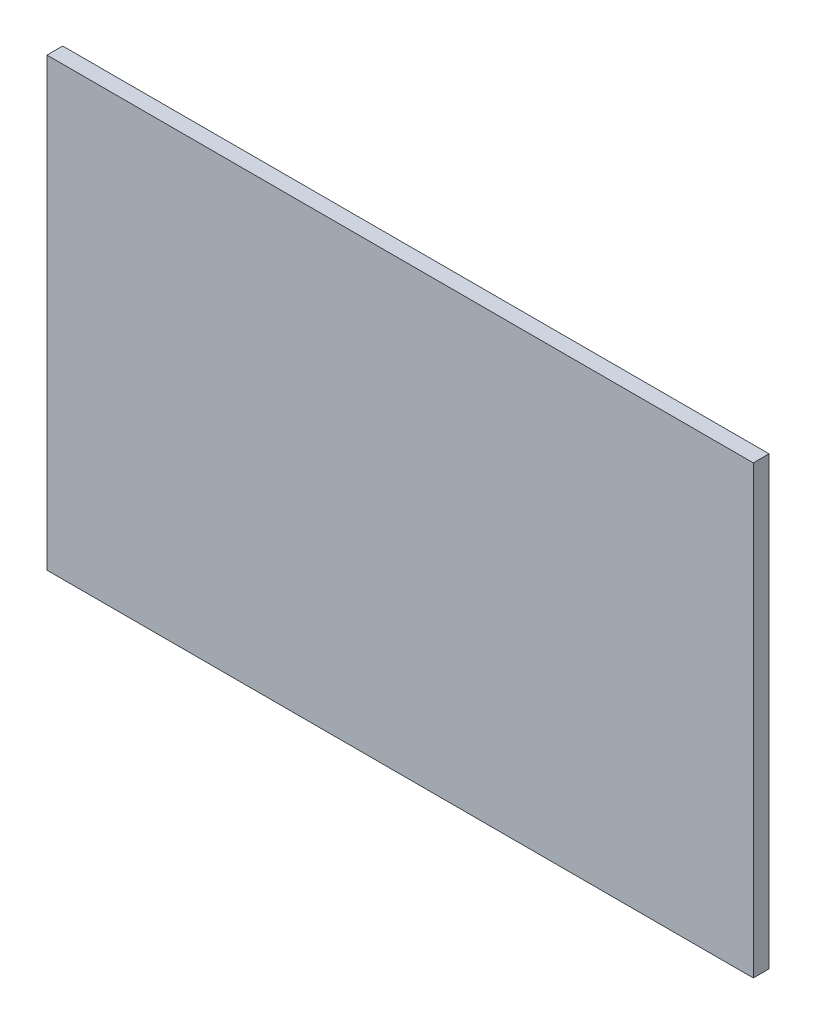
ISO-10303-21;
HEADER;
FILE_DESCRIPTION(('STEP AP214'),'2;1');
FILE_NAME('part.step','',(''),(''),'','','');
FILE_SCHEMA(('AUTOMOTIVE_DESIGN { 1 0 10303 214 1 1 1 1 }'));
ENDSEC;
DATA;
#1=APPLICATION_CONTEXT('core data for automotive mechanical design processes');
#2=APPLICATION_PROTOCOL_DEFINITION('international standard','automotive_design',2000,#1);
#3=PRODUCT_CONTEXT('',#1,'mechanical');
#4=PRODUCT('Part','Part','',(#3));
#5=PRODUCT_RELATED_PRODUCT_CATEGORY('part','',(#4));
#6=PRODUCT_DEFINITION_FORMATION('','',#4);
#7=PRODUCT_DEFINITION_CONTEXT('part definition',#1,'design');
#8=PRODUCT_DEFINITION('design','',#6,#7);
#9=PRODUCT_DEFINITION_SHAPE('','',#8);
#10=(LENGTH_UNIT() NAMED_UNIT(*) SI_UNIT(.MILLI.,.METRE.));
#11=(NAMED_UNIT(*) PLANE_ANGLE_UNIT() SI_UNIT($,.RADIAN.));
#12=(NAMED_UNIT(*) SI_UNIT($,.STERADIAN.) SOLID_ANGLE_UNIT());
#13=UNCERTAINTY_MEASURE_WITH_UNIT(LENGTH_MEASURE(1.E-05),#10,'distance_accuracy_value','');
#14=(GEOMETRIC_REPRESENTATION_CONTEXT(3) GLOBAL_UNCERTAINTY_ASSIGNED_CONTEXT((#13)) GLOBAL_UNIT_ASSIGNED_CONTEXT((#10,
#11,#12)) REPRESENTATION_CONTEXT('',''));
#15=CARTESIAN_POINT('',(0.,0.,0.));
#16=DIRECTION('',(0.,0.,1.));
#17=DIRECTION('',(1.,0.,0.));
#18=AXIS2_PLACEMENT_3D('',#15,#16,#17);
#19=CARTESIAN_POINT('',(0.,0.,17.4625));
#20=DIRECTION('',(1.,0.,0.));
#21=DIRECTION('',(0.,0.,-1.));
#22=AXIS2_PLACEMENT_3D('',#19,#20,#21);
#23=PLANE('',#22);
#24=DIRECTION('',(0.,-1.,0.));
#25=VECTOR('',#24,1.);
#26=CARTESIAN_POINT('',(0.,0.,0.));
#27=LINE('',#26,#25);
#28=CARTESIAN_POINT('',(0.,495.3,0.));
#29=VERTEX_POINT('',#28);
#30=CARTESIAN_POINT('',(0.,0.,0.));
#31=VERTEX_POINT('',#30);
#32=EDGE_CURVE('E95',#29,#31,#27,.T.);
#33=ORIENTED_EDGE('',*,*,#32,.T.);
#34=DIRECTION('',(0.,0.,-1.));
#35=VECTOR('',#34,1.);
#36=CARTESIAN_POINT('',(0.,0.,17.4625));
#37=LINE('',#36,#35);
#38=CARTESIAN_POINT('',(0.,0.,17.4625));
#39=VERTEX_POINT('',#38);
#40=EDGE_CURVE('E11',#39,#31,#37,.T.);
#41=ORIENTED_EDGE('',*,*,#40,.F.);
#42=DIRECTION('',(0.,-1.,0.));
#43=VECTOR('',#42,1.);
#44=CARTESIAN_POINT('',(0.,0.,17.4625));
#45=LINE('',#44,#43);
#46=CARTESIAN_POINT('',(0.,495.3,17.4625));
#47=VERTEX_POINT('',#46);
#48=EDGE_CURVE('E83',#47,#39,#45,.T.);
#49=ORIENTED_EDGE('',*,*,#48,.F.);
#50=DIRECTION('',(0.,0.,-1.));
#51=VECTOR('',#50,1.);
#52=CARTESIAN_POINT('',(0.,495.3,17.4625));
#53=LINE('',#52,#51);
#54=EDGE_CURVE('E91',#47,#29,#53,.T.);
#55=ORIENTED_EDGE('',*,*,#54,.T.);
#56=EDGE_LOOP('',(#33,#41,#49,#55));
#57=FACE_BOUND('',#56,.T.);
#58=ADVANCED_FACE('F32',(#57),#23,.F.);
#59=CARTESIAN_POINT('',(0.,0.,17.4625));
#60=DIRECTION('',(0.,1.,0.));
#61=DIRECTION('',(0.,0.,1.));
#62=AXIS2_PLACEMENT_3D('',#59,#60,#61);
#63=PLANE('',#62);
#64=DIRECTION('',(1.,0.,0.));
#65=VECTOR('',#64,1.);
#66=CARTESIAN_POINT('',(0.,0.,0.));
#67=LINE('',#66,#65);
#68=CARTESIAN_POINT('',(784.225,0.,0.));
#69=VERTEX_POINT('',#68);
#70=EDGE_CURVE('E87',#31,#69,#67,.T.);
#71=ORIENTED_EDGE('',*,*,#70,.T.);
#72=DIRECTION('',(0.,0.,-1.));
#73=VECTOR('',#72,1.);
#74=CARTESIAN_POINT('',(784.225,0.,17.4625));
#75=LINE('',#74,#73);
#76=CARTESIAN_POINT('',(784.225,0.,17.4625));
#77=VERTEX_POINT('',#76);
#78=EDGE_CURVE('E40',#77,#69,#75,.T.);
#79=ORIENTED_EDGE('',*,*,#78,.F.);
#80=DIRECTION('',(1.,0.,0.));
#81=VECTOR('',#80,1.);
#82=CARTESIAN_POINT('',(0.,0.,17.4625));
#83=LINE('',#82,#81);
#84=EDGE_CURVE('E78',#39,#77,#83,.T.);
#85=ORIENTED_EDGE('',*,*,#84,.F.);
#86=ORIENTED_EDGE('',*,*,#40,.T.);
#87=EDGE_LOOP('',(#71,#79,#85,#86));
#88=FACE_BOUND('',#87,.T.);
#89=ADVANCED_FACE('F86',(#88),#63,.F.);
#90=CARTESIAN_POINT('',(784.225,0.,17.4625));
#91=DIRECTION('',(-1.,0.,0.));
#92=DIRECTION('',(0.,0.,1.));
#93=AXIS2_PLACEMENT_3D('',#90,#91,#92);
#94=PLANE('',#93);
#95=DIRECTION('',(0.,1.,0.));
#96=VECTOR('',#95,1.);
#97=CARTESIAN_POINT('',(784.225,0.,0.));
#98=LINE('',#97,#96);
#99=CARTESIAN_POINT('',(784.225,495.3,0.));
#100=VERTEX_POINT('',#99);
#101=EDGE_CURVE('E65',#69,#100,#98,.T.);
#102=ORIENTED_EDGE('',*,*,#101,.T.);
#103=DIRECTION('',(0.,0.,-1.));
#104=VECTOR('',#103,1.);
#105=CARTESIAN_POINT('',(784.225,495.3,17.4625));
#106=LINE('',#105,#104);
#107=CARTESIAN_POINT('',(784.225,495.3,17.4625));
#108=VERTEX_POINT('',#107);
#109=EDGE_CURVE('E88',#108,#100,#106,.T.);
#110=ORIENTED_EDGE('',*,*,#109,.F.);
#111=DIRECTION('',(0.,1.,0.));
#112=VECTOR('',#111,1.);
#113=CARTESIAN_POINT('',(784.225,0.,17.4625));
#114=LINE('',#113,#112);
#115=EDGE_CURVE('E81',#77,#108,#114,.T.);
#116=ORIENTED_EDGE('',*,*,#115,.F.);
#117=ORIENTED_EDGE('',*,*,#78,.T.);
#118=EDGE_LOOP('',(#102,#110,#116,#117));
#119=FACE_BOUND('',#118,.T.);
#120=ADVANCED_FACE('F89',(#119),#94,.F.);
#121=CARTESIAN_POINT('',(0.,495.3,17.4625));
#122=DIRECTION('',(0.,-1.,0.));
#123=DIRECTION('',(0.,0.,-1.));
#124=AXIS2_PLACEMENT_3D('',#121,#122,#123);
#125=PLANE('',#124);
#126=DIRECTION('',(-1.,0.,0.));
#127=VECTOR('',#126,1.);
#128=CARTESIAN_POINT('',(0.,495.3,0.));
#129=LINE('',#128,#127);
#130=EDGE_CURVE('E71',#100,#29,#129,.T.);
#131=ORIENTED_EDGE('',*,*,#130,.T.);
#132=ORIENTED_EDGE('',*,*,#54,.F.);
#133=DIRECTION('',(-1.,0.,0.));
#134=VECTOR('',#133,1.);
#135=CARTESIAN_POINT('',(0.,495.3,17.4625));
#136=LINE('',#135,#134);
#137=EDGE_CURVE('E48',#108,#47,#136,.T.);
#138=ORIENTED_EDGE('',*,*,#137,.F.);
#139=ORIENTED_EDGE('',*,*,#109,.T.);
#140=EDGE_LOOP('',(#131,#132,#138,#139));
#141=FACE_BOUND('',#140,.T.);
#142=ADVANCED_FACE('F102',(#141),#125,.F.);
#143=CARTESIAN_POINT('',(0.,0.,17.4625));
#144=DIRECTION('',(0.,0.,-1.));
#145=DIRECTION('',(-1.,0.,0.));
#146=AXIS2_PLACEMENT_3D('',#143,#144,#145);
#147=PLANE('',#146);
#148=ORIENTED_EDGE('',*,*,#48,.T.);
#149=ORIENTED_EDGE('',*,*,#84,.T.);
#150=ORIENTED_EDGE('',*,*,#115,.T.);
#151=ORIENTED_EDGE('',*,*,#137,.T.);
#152=EDGE_LOOP('',(#148,#149,#150,#151));
#153=FACE_BOUND('',#152,.T.);
#154=ADVANCED_FACE('F79',(#153),#147,.F.);
#155=CARTESIAN_POINT('',(0.,0.,0.));
#156=DIRECTION('',(0.,0.,-1.));
#157=DIRECTION('',(-1.,0.,0.));
#158=AXIS2_PLACEMENT_3D('',#155,#156,#157);
#159=PLANE('',#158);
#160=ORIENTED_EDGE('',*,*,#32,.F.);
#161=ORIENTED_EDGE('',*,*,#130,.F.);
#162=ORIENTED_EDGE('',*,*,#101,.F.);
#163=ORIENTED_EDGE('',*,*,#70,.F.);
#164=EDGE_LOOP('',(#160,#161,#162,#163));
#165=FACE_BOUND('',#164,.T.);
#166=ADVANCED_FACE('F105',(#165),#159,.T.);
#167=CLOSED_SHELL('',(#58,#89,#120,#142,#154,#166));
#168=MANIFOLD_SOLID_BREP('B2',#167);
#169=ADVANCED_BREP_SHAPE_REPRESENTATION('',(#18,#168),#14);
#170=SHAPE_DEFINITION_REPRESENTATION(#9,#169);
ENDSEC;
END-ISO-10303-21;
